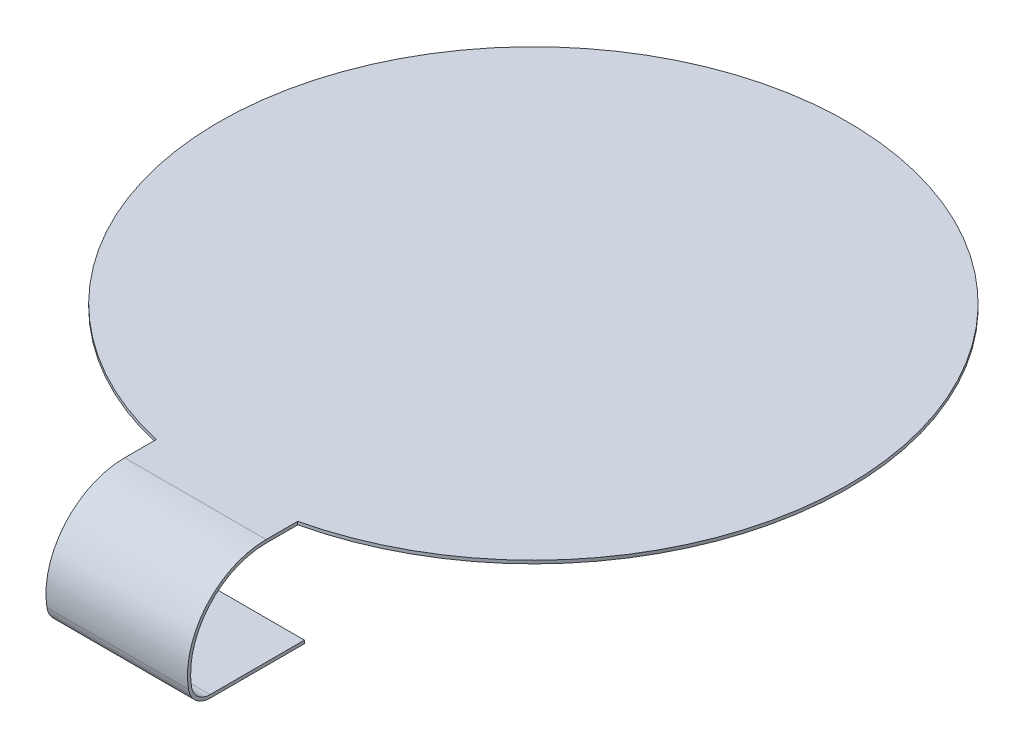
ISO-10303-21;
HEADER;
FILE_DESCRIPTION(('STEP AP214'),'2;1');
FILE_NAME('part.step','',(''),(''),'','','');
FILE_SCHEMA(('AUTOMOTIVE_DESIGN { 1 0 10303 214 1 1 1 1 }'));
ENDSEC;
DATA;
#1=APPLICATION_CONTEXT('core data for automotive mechanical design processes');
#2=APPLICATION_PROTOCOL_DEFINITION('international standard','automotive_design',2000,#1);
#3=PRODUCT_CONTEXT('',#1,'mechanical');
#4=PRODUCT('Part','Part','',(#3));
#5=PRODUCT_RELATED_PRODUCT_CATEGORY('part','',(#4));
#6=PRODUCT_DEFINITION_FORMATION('','',#4);
#7=PRODUCT_DEFINITION_CONTEXT('part definition',#1,'design');
#8=PRODUCT_DEFINITION('design','',#6,#7);
#9=PRODUCT_DEFINITION_SHAPE('','',#8);
#10=(LENGTH_UNIT() NAMED_UNIT(*) SI_UNIT(.MILLI.,.METRE.));
#11=(NAMED_UNIT(*) PLANE_ANGLE_UNIT() SI_UNIT($,.RADIAN.));
#12=(NAMED_UNIT(*) SI_UNIT($,.STERADIAN.) SOLID_ANGLE_UNIT());
#13=UNCERTAINTY_MEASURE_WITH_UNIT(LENGTH_MEASURE(1.E-05),#10,'distance_accuracy_value','');
#14=(GEOMETRIC_REPRESENTATION_CONTEXT(3) GLOBAL_UNCERTAINTY_ASSIGNED_CONTEXT((#13)) GLOBAL_UNIT_ASSIGNED_CONTEXT((#10,
#11,#12)) REPRESENTATION_CONTEXT('',''));
#15=CARTESIAN_POINT('',(0.,0.,0.));
#16=DIRECTION('',(0.,0.,1.));
#17=DIRECTION('',(1.,0.,0.));
#18=AXIS2_PLACEMENT_3D('',#15,#16,#17);
#19=CARTESIAN_POINT('',(0.,1.2,-1.53064501));
#20=DIRECTION('',(0.,-1.,0.));
#21=DIRECTION('',(0.,0.,-1.));
#22=AXIS2_PLACEMENT_3D('',#19,#20,#21);
#23=CYLINDRICAL_SURFACE('',#22,10.);
#24=DIRECTION('',(0.,-1.,0.));
#25=VECTOR('',#24,1.);
#26=CARTESIAN_POINT('',(2.25,1.2,8.21294262495254));
#27=LINE('',#26,#25);
#28=CARTESIAN_POINT('',(2.25,1.1,8.21294262495254));
#29=VERTEX_POINT('',#28);
#30=CARTESIAN_POINT('',(2.25,1.2,8.21294262495254));
#31=VERTEX_POINT('',#30);
#32=EDGE_CURVE('E183',#29,#31,#27,.F.);
#33=ORIENTED_EDGE('',*,*,#32,.F.);
#34=CARTESIAN_POINT('',(0.,1.1,-1.53064501));
#35=DIRECTION('',(0.,1.,0.));
#36=DIRECTION('',(0.,0.,1.));
#37=AXIS2_PLACEMENT_3D('',#34,#35,#36);
#38=CIRCLE('',#37,10.);
#39=CARTESIAN_POINT('',(-2.25,1.1,8.21294262495254));
#40=VERTEX_POINT('',#39);
#41=EDGE_CURVE('E38',#29,#40,#38,.T.);
#42=ORIENTED_EDGE('',*,*,#41,.T.);
#43=DIRECTION('',(0.,-1.,0.));
#44=VECTOR('',#43,1.);
#45=CARTESIAN_POINT('',(-2.25,1.2,8.21294262495254));
#46=LINE('',#45,#44);
#47=CARTESIAN_POINT('',(-2.25,1.2,8.21294262495254));
#48=VERTEX_POINT('',#47);
#49=EDGE_CURVE('E49',#48,#40,#46,.T.);
#50=ORIENTED_EDGE('',*,*,#49,.F.);
#51=CARTESIAN_POINT('',(0.,1.2,-1.53064501));
#52=DIRECTION('',(0.,1.,0.));
#53=DIRECTION('',(0.,0.,1.));
#54=AXIS2_PLACEMENT_3D('',#51,#52,#53);
#55=CIRCLE('',#54,10.);
#56=EDGE_CURVE('E11',#31,#48,#55,.T.);
#57=ORIENTED_EDGE('',*,*,#56,.F.);
#58=EDGE_LOOP('',(#33,#42,#50,#57));
#59=FACE_BOUND('',#58,.T.);
#60=ADVANCED_FACE('F35',(#59),#23,.T.);
#61=CARTESIAN_POINT('',(0.,1.2,-1.53064501));
#62=DIRECTION('',(0.,1.,0.));
#63=DIRECTION('',(0.,0.,1.));
#64=AXIS2_PLACEMENT_3D('',#61,#62,#63);
#65=PLANE('',#64);
#66=ORIENTED_EDGE('',*,*,#56,.T.);
#67=DIRECTION('',(0.,0.,1.));
#68=VECTOR('',#67,1.);
#69=CARTESIAN_POINT('',(-2.25,1.2,8.46935499));
#70=LINE('',#69,#68);
#71=CARTESIAN_POINT('',(-2.25,1.2,9.21935499));
#72=VERTEX_POINT('',#71);
#73=EDGE_CURVE('E132',#48,#72,#70,.T.);
#74=ORIENTED_EDGE('',*,*,#73,.T.);
#75=DIRECTION('',(-1.,0.,0.));
#76=VECTOR('',#75,1.);
#77=CARTESIAN_POINT('',(9.81704245274453,1.2,9.21935499));
#78=LINE('',#77,#76);
#79=CARTESIAN_POINT('',(2.25,1.2,9.21935499));
#80=VERTEX_POINT('',#79);
#81=EDGE_CURVE('E178',#80,#72,#78,.T.);
#82=ORIENTED_EDGE('',*,*,#81,.F.);
#83=DIRECTION('',(0.,0.,1.));
#84=VECTOR('',#83,1.);
#85=CARTESIAN_POINT('',(2.25,1.2,8.46935499));
#86=LINE('',#85,#84);
#87=EDGE_CURVE('E167',#31,#80,#86,.T.);
#88=ORIENTED_EDGE('',*,*,#87,.F.);
#89=EDGE_LOOP('',(#66,#74,#82,#88));
#90=FACE_BOUND('',#89,.T.);
#91=ADVANCED_FACE('F213',(#90),#65,.T.);
#92=CARTESIAN_POINT('',(0.,1.1,-1.53064501));
#93=DIRECTION('',(0.,1.,0.));
#94=DIRECTION('',(0.,0.,1.));
#95=AXIS2_PLACEMENT_3D('',#92,#93,#94);
#96=PLANE('',#95);
#97=ORIENTED_EDGE('',*,*,#41,.F.);
#98=DIRECTION('',(0.,0.,1.));
#99=VECTOR('',#98,1.);
#100=CARTESIAN_POINT('',(2.25,1.1,8.46935499));
#101=LINE('',#100,#99);
#102=CARTESIAN_POINT('',(2.25,1.1,9.21935499));
#103=VERTEX_POINT('',#102);
#104=EDGE_CURVE('E160',#29,#103,#101,.T.);
#105=ORIENTED_EDGE('',*,*,#104,.T.);
#106=DIRECTION('',(-1.,0.,0.));
#107=VECTOR('',#106,1.);
#108=CARTESIAN_POINT('',(9.81704245274453,1.1,9.21935499));
#109=LINE('',#108,#107);
#110=CARTESIAN_POINT('',(-2.25,1.1,9.21935499));
#111=VERTEX_POINT('',#110);
#112=EDGE_CURVE('E156',#103,#111,#109,.T.);
#113=ORIENTED_EDGE('',*,*,#112,.T.);
#114=DIRECTION('',(0.,0.,1.));
#115=VECTOR('',#114,1.);
#116=CARTESIAN_POINT('',(-2.25,1.1,8.46935499));
#117=LINE('',#116,#115);
#118=EDGE_CURVE('E154',#40,#111,#117,.T.);
#119=ORIENTED_EDGE('',*,*,#118,.F.);
#120=EDGE_LOOP('',(#97,#105,#113,#119));
#121=FACE_BOUND('',#120,.T.);
#122=ADVANCED_FACE('F193',(#121),#96,.F.);
#123=CARTESIAN_POINT('',(2.25,-2.18,8.));
#124=DIRECTION('',(-1.,0.,0.));
#125=DIRECTION('',(0.,0.,1.));
#126=AXIS2_PLACEMENT_3D('',#123,#124,#125);
#127=PLANE('',#126);
#128=DIRECTION('',(0.,-1.,0.));
#129=VECTOR('',#128,1.);
#130=CARTESIAN_POINT('',(2.25,-2.18,8.));
#131=LINE('',#130,#129);
#132=CARTESIAN_POINT('',(2.25,-2.18,8.));
#133=VERTEX_POINT('',#132);
#134=CARTESIAN_POINT('',(2.25,-2.28,8.));
#135=VERTEX_POINT('',#134);
#136=EDGE_CURVE('E124',#133,#135,#131,.T.);
#137=ORIENTED_EDGE('',*,*,#136,.F.);
#138=DIRECTION('',(0.,0.,-1.));
#139=VECTOR('',#138,1.);
#140=CARTESIAN_POINT('',(2.25,-2.18,10.5));
#141=LINE('',#140,#139);
#142=CARTESIAN_POINT('',(2.25,-2.18,11.));
#143=VERTEX_POINT('',#142);
#144=EDGE_CURVE('E107',#143,#133,#141,.T.);
#145=ORIENTED_EDGE('',*,*,#144,.F.);
#146=CARTESIAN_POINT('',(2.25,-1.58299231961773,11.));
#147=DIRECTION('',(-1.,0.,0.));
#148=DIRECTION('',(0.,0.,1.));
#149=AXIS2_PLACEMENT_3D('',#146,#147,#148);
#150=CIRCLE('',#149,0.597007680382272);
#151=CARTESIAN_POINT('',(2.25,-1.67669687202359,11.5896080285188));
#152=VERTEX_POINT('',#151);
#153=EDGE_CURVE('E118',#152,#143,#150,.F.);
#154=ORIENTED_EDGE('',*,*,#153,.F.);
#155=CARTESIAN_POINT('',(2.25,-1.3,9.21935499));
#156=DIRECTION('',(-1.,0.,0.));
#157=DIRECTION('',(0.,0.,1.));
#158=AXIS2_PLACEMENT_3D('',#155,#156,#157);
#159=CIRCLE('',#158,2.4);
#160=EDGE_CURVE('E157',#103,#152,#159,.F.);
#161=ORIENTED_EDGE('',*,*,#160,.F.);
#162=ORIENTED_EDGE('',*,*,#104,.F.);
#163=ORIENTED_EDGE('',*,*,#32,.T.);
#164=ORIENTED_EDGE('',*,*,#87,.T.);
#165=CARTESIAN_POINT('',(2.25,-1.3,9.21935499));
#166=DIRECTION('',(-1.,0.,0.));
#167=DIRECTION('',(0.,0.,1.));
#168=AXIS2_PLACEMENT_3D('',#165,#166,#167);
#169=CIRCLE('',#168,2.5);
#170=CARTESIAN_POINT('',(2.25,-1.69239257502457,11.6883685717904));
#171=VERTEX_POINT('',#170);
#172=EDGE_CURVE('E165',#80,#171,#169,.F.);
#173=ORIENTED_EDGE('',*,*,#172,.T.);
#174=CARTESIAN_POINT('',(2.25,-1.58299231961773,11.));
#175=DIRECTION('',(-1.,0.,0.));
#176=DIRECTION('',(0.,0.,1.));
#177=AXIS2_PLACEMENT_3D('',#174,#175,#176);
#178=CIRCLE('',#177,0.697007680382272);
#179=CARTESIAN_POINT('',(2.25,-2.28,11.));
#180=VERTEX_POINT('',#179);
#181=EDGE_CURVE('E163',#171,#180,#178,.F.);
#182=ORIENTED_EDGE('',*,*,#181,.T.);
#183=DIRECTION('',(0.,0.,-1.));
#184=VECTOR('',#183,1.);
#185=CARTESIAN_POINT('',(2.25,-2.28,10.5));
#186=LINE('',#185,#184);
#187=EDGE_CURVE('E117',#180,#135,#186,.T.);
#188=ORIENTED_EDGE('',*,*,#187,.T.);
#189=EDGE_LOOP('',(#137,#145,#154,#161,#162,#163,#164,#173,#182,#188));
#190=FACE_BOUND('',#189,.T.);
#191=ADVANCED_FACE('F129',(#190),#127,.F.);
#192=CARTESIAN_POINT('',(-2.25,-2.18,10.5));
#193=DIRECTION('',(1.,0.,0.));
#194=DIRECTION('',(0.,0.,-1.));
#195=AXIS2_PLACEMENT_3D('',#192,#193,#194);
#196=PLANE('',#195);
#197=DIRECTION('',(0.,-1.,0.));
#198=VECTOR('',#197,1.);
#199=CARTESIAN_POINT('',(-2.25,-2.18,8.));
#200=LINE('',#199,#198);
#201=CARTESIAN_POINT('',(-2.25,-2.18,8.));
#202=VERTEX_POINT('',#201);
#203=CARTESIAN_POINT('',(-2.25,-2.28,8.));
#204=VERTEX_POINT('',#203);
#205=EDGE_CURVE('E126',#202,#204,#200,.T.);
#206=ORIENTED_EDGE('',*,*,#205,.T.);
#207=DIRECTION('',(0.,0.,-1.));
#208=VECTOR('',#207,1.);
#209=CARTESIAN_POINT('',(-2.25,-2.28,10.5));
#210=LINE('',#209,#208);
#211=CARTESIAN_POINT('',(-2.25,-2.28,11.));
#212=VERTEX_POINT('',#211);
#213=EDGE_CURVE('E144',#212,#204,#210,.T.);
#214=ORIENTED_EDGE('',*,*,#213,.F.);
#215=CARTESIAN_POINT('',(-2.25,-1.58299231961773,11.));
#216=DIRECTION('',(1.,0.,0.));
#217=DIRECTION('',(0.,0.,-1.));
#218=AXIS2_PLACEMENT_3D('',#215,#216,#217);
#219=CIRCLE('',#218,0.697007680382272);
#220=CARTESIAN_POINT('',(-2.25,-1.69239257502457,11.6883685717904));
#221=VERTEX_POINT('',#220);
#222=EDGE_CURVE('E141',#221,#212,#219,.T.);
#223=ORIENTED_EDGE('',*,*,#222,.F.);
#224=CARTESIAN_POINT('',(-2.25,-1.3,9.21935499));
#225=DIRECTION('',(1.,0.,0.));
#226=DIRECTION('',(0.,0.,-1.));
#227=AXIS2_PLACEMENT_3D('',#224,#225,#226);
#228=CIRCLE('',#227,2.5);
#229=EDGE_CURVE('E134',#72,#221,#228,.T.);
#230=ORIENTED_EDGE('',*,*,#229,.F.);
#231=ORIENTED_EDGE('',*,*,#73,.F.);
#232=ORIENTED_EDGE('',*,*,#49,.T.);
#233=ORIENTED_EDGE('',*,*,#118,.T.);
#234=CARTESIAN_POINT('',(-2.25,-1.3,9.21935499));
#235=DIRECTION('',(1.,0.,0.));
#236=DIRECTION('',(0.,0.,-1.));
#237=AXIS2_PLACEMENT_3D('',#234,#235,#236);
#238=CIRCLE('',#237,2.4);
#239=CARTESIAN_POINT('',(-2.25,-1.67669687202359,11.5896080285188));
#240=VERTEX_POINT('',#239);
#241=EDGE_CURVE('E151',#111,#240,#238,.T.);
#242=ORIENTED_EDGE('',*,*,#241,.T.);
#243=CARTESIAN_POINT('',(-2.25,-1.58299231961773,11.));
#244=DIRECTION('',(1.,0.,0.));
#245=DIRECTION('',(0.,0.,-1.));
#246=AXIS2_PLACEMENT_3D('',#243,#244,#245);
#247=CIRCLE('',#246,0.597007680382272);
#248=CARTESIAN_POINT('',(-2.25,-2.18,11.));
#249=VERTEX_POINT('',#248);
#250=EDGE_CURVE('E148',#240,#249,#247,.T.);
#251=ORIENTED_EDGE('',*,*,#250,.T.);
#252=DIRECTION('',(0.,0.,-1.));
#253=VECTOR('',#252,1.);
#254=CARTESIAN_POINT('',(-2.25,-2.18,10.5));
#255=LINE('',#254,#253);
#256=EDGE_CURVE('E146',#249,#202,#255,.T.);
#257=ORIENTED_EDGE('',*,*,#256,.T.);
#258=EDGE_LOOP('',(#206,#214,#223,#230,#231,#232,#233,#242,#251,#257));
#259=FACE_BOUND('',#258,.T.);
#260=ADVANCED_FACE('F191',(#259),#196,.F.);
#261=CARTESIAN_POINT('',(9.81704245274453,-1.3,9.21935499));
#262=DIRECTION('',(-1.,0.,0.));
#263=DIRECTION('',(0.,0.,1.));
#264=AXIS2_PLACEMENT_3D('',#261,#262,#263);
#265=CYLINDRICAL_SURFACE('',#264,2.4);
#266=ORIENTED_EDGE('',*,*,#112,.F.);
#267=ORIENTED_EDGE('',*,*,#160,.T.);
#268=DIRECTION('',(-1.,0.,0.));
#269=VECTOR('',#268,1.);
#270=CARTESIAN_POINT('',(9.81704245274453,-1.67669687202359,11.5896080285188));
#271=LINE('',#270,#269);
#272=EDGE_CURVE('E171',#152,#240,#271,.T.);
#273=ORIENTED_EDGE('',*,*,#272,.T.);
#274=ORIENTED_EDGE('',*,*,#241,.F.);
#275=EDGE_LOOP('',(#266,#267,#273,#274));
#276=FACE_BOUND('',#275,.T.);
#277=ADVANCED_FACE('F198',(#276),#265,.F.);
#278=CARTESIAN_POINT('',(9.81704245274453,-1.58299231961773,11.));
#279=DIRECTION('',(-1.,0.,0.));
#280=DIRECTION('',(0.,0.,1.));
#281=AXIS2_PLACEMENT_3D('',#278,#279,#280);
#282=CYLINDRICAL_SURFACE('',#281,0.597007680382272);
#283=ORIENTED_EDGE('',*,*,#272,.F.);
#284=ORIENTED_EDGE('',*,*,#153,.T.);
#285=DIRECTION('',(-1.,0.,0.));
#286=VECTOR('',#285,1.);
#287=CARTESIAN_POINT('',(9.81704245274453,-2.18,11.));
#288=LINE('',#287,#286);
#289=EDGE_CURVE('E113',#143,#249,#288,.T.);
#290=ORIENTED_EDGE('',*,*,#289,.T.);
#291=ORIENTED_EDGE('',*,*,#250,.F.);
#292=EDGE_LOOP('',(#283,#284,#290,#291));
#293=FACE_BOUND('',#292,.T.);
#294=ADVANCED_FACE('F202',(#293),#282,.F.);
#295=CARTESIAN_POINT('',(9.81704245274453,-2.18,10.5));
#296=DIRECTION('',(0.,-1.,0.));
#297=DIRECTION('',(0.,0.,-1.));
#298=AXIS2_PLACEMENT_3D('',#295,#296,#297);
#299=PLANE('',#298);
#300=DIRECTION('',(-1.,0.,0.));
#301=VECTOR('',#300,1.);
#302=CARTESIAN_POINT('',(-2.25,-2.18,8.));
#303=LINE('',#302,#301);
#304=EDGE_CURVE('E111',#133,#202,#303,.T.);
#305=ORIENTED_EDGE('',*,*,#304,.T.);
#306=ORIENTED_EDGE('',*,*,#256,.F.);
#307=ORIENTED_EDGE('',*,*,#289,.F.);
#308=ORIENTED_EDGE('',*,*,#144,.T.);
#309=EDGE_LOOP('',(#305,#306,#307,#308));
#310=FACE_BOUND('',#309,.T.);
#311=ADVANCED_FACE('F109',(#310),#299,.F.);
#312=CARTESIAN_POINT('',(9.81704245274453,-2.28,10.5));
#313=DIRECTION('',(0.,-1.,0.));
#314=DIRECTION('',(0.,0.,-1.));
#315=AXIS2_PLACEMENT_3D('',#312,#313,#314);
#316=PLANE('',#315);
#317=DIRECTION('',(-1.,0.,0.));
#318=VECTOR('',#317,1.);
#319=CARTESIAN_POINT('',(-2.25,-2.28,8.));
#320=LINE('',#319,#318);
#321=EDGE_CURVE('E127',#135,#204,#320,.T.);
#322=ORIENTED_EDGE('',*,*,#321,.F.);
#323=ORIENTED_EDGE('',*,*,#187,.F.);
#324=DIRECTION('',(-1.,0.,0.));
#325=VECTOR('',#324,1.);
#326=CARTESIAN_POINT('',(9.81704245274453,-2.28,11.));
#327=LINE('',#326,#325);
#328=EDGE_CURVE('E174',#180,#212,#327,.T.);
#329=ORIENTED_EDGE('',*,*,#328,.T.);
#330=ORIENTED_EDGE('',*,*,#213,.T.);
#331=EDGE_LOOP('',(#322,#323,#329,#330));
#332=FACE_BOUND('',#331,.T.);
#333=ADVANCED_FACE('F209',(#332),#316,.T.);
#334=CARTESIAN_POINT('',(9.81704245274453,-1.58299231961773,11.));
#335=DIRECTION('',(-1.,0.,0.));
#336=DIRECTION('',(0.,0.,1.));
#337=AXIS2_PLACEMENT_3D('',#334,#335,#336);
#338=CYLINDRICAL_SURFACE('',#337,0.697007680382272);
#339=ORIENTED_EDGE('',*,*,#181,.F.);
#340=DIRECTION('',(-1.,0.,0.));
#341=VECTOR('',#340,1.);
#342=CARTESIAN_POINT('',(9.81704245274453,-1.69239257502457,11.6883685717904));
#343=LINE('',#342,#341);
#344=EDGE_CURVE('E176',#171,#221,#343,.T.);
#345=ORIENTED_EDGE('',*,*,#344,.T.);
#346=ORIENTED_EDGE('',*,*,#222,.T.);
#347=ORIENTED_EDGE('',*,*,#328,.F.);
#348=EDGE_LOOP('',(#339,#345,#346,#347));
#349=FACE_BOUND('',#348,.T.);
#350=ADVANCED_FACE('F226',(#349),#338,.T.);
#351=CARTESIAN_POINT('',(9.81704245274453,-1.3,9.21935499));
#352=DIRECTION('',(-1.,0.,0.));
#353=DIRECTION('',(0.,0.,1.));
#354=AXIS2_PLACEMENT_3D('',#351,#352,#353);
#355=CYLINDRICAL_SURFACE('',#354,2.5);
#356=ORIENTED_EDGE('',*,*,#172,.F.);
#357=ORIENTED_EDGE('',*,*,#81,.T.);
#358=ORIENTED_EDGE('',*,*,#229,.T.);
#359=ORIENTED_EDGE('',*,*,#344,.F.);
#360=EDGE_LOOP('',(#356,#357,#358,#359));
#361=FACE_BOUND('',#360,.T.);
#362=ADVANCED_FACE('F223',(#361),#355,.T.);
#363=CARTESIAN_POINT('',(-2.25,-2.18,8.));
#364=DIRECTION('',(0.,0.,1.));
#365=DIRECTION('',(1.,0.,0.));
#366=AXIS2_PLACEMENT_3D('',#363,#364,#365);
#367=PLANE('',#366);
#368=ORIENTED_EDGE('',*,*,#321,.T.);
#369=ORIENTED_EDGE('',*,*,#205,.F.);
#370=ORIENTED_EDGE('',*,*,#304,.F.);
#371=ORIENTED_EDGE('',*,*,#136,.T.);
#372=EDGE_LOOP('',(#368,#369,#370,#371));
#373=FACE_BOUND('',#372,.T.);
#374=ADVANCED_FACE('F123',(#373),#367,.F.);
#375=CLOSED_SHELL('',(#60,#91,#122,#191,#260,#277,#294,#311,#333,#350,#362,#374));
#376=MANIFOLD_SOLID_BREP('B2',#375);
#377=ADVANCED_BREP_SHAPE_REPRESENTATION('',(#18,#376),#14);
#378=SHAPE_DEFINITION_REPRESENTATION(#9,#377);
ENDSEC;
END-ISO-10303-21;
